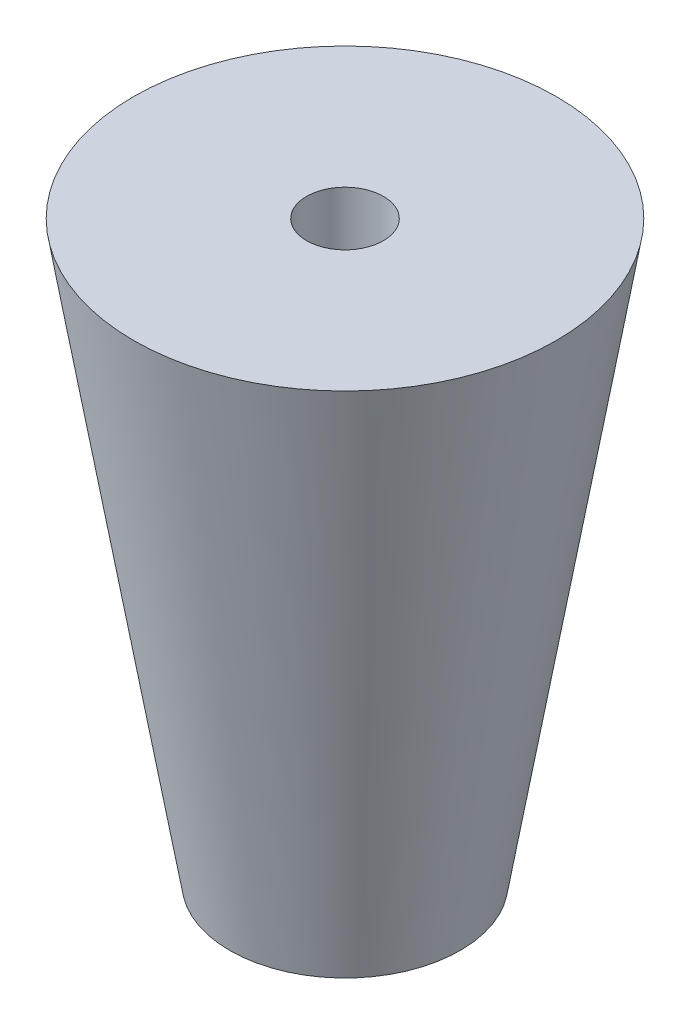
ISO-10303-21;
HEADER;
FILE_DESCRIPTION(('STEP AP214'),'2;1');
FILE_NAME('part.step','',(''),(''),'','','');
FILE_SCHEMA(('AUTOMOTIVE_DESIGN { 1 0 10303 214 1 1 1 1 }'));
ENDSEC;
DATA;
#1=APPLICATION_CONTEXT('core data for automotive mechanical design processes');
#2=APPLICATION_PROTOCOL_DEFINITION('international standard','automotive_design',2000,#1);
#3=PRODUCT_CONTEXT('',#1,'mechanical');
#4=PRODUCT('Part','Part','',(#3));
#5=PRODUCT_RELATED_PRODUCT_CATEGORY('part','',(#4));
#6=PRODUCT_DEFINITION_FORMATION('','',#4);
#7=PRODUCT_DEFINITION_CONTEXT('part definition',#1,'design');
#8=PRODUCT_DEFINITION('design','',#6,#7);
#9=PRODUCT_DEFINITION_SHAPE('','',#8);
#10=(LENGTH_UNIT() NAMED_UNIT(*) SI_UNIT(.MILLI.,.METRE.));
#11=(NAMED_UNIT(*) PLANE_ANGLE_UNIT() SI_UNIT($,.RADIAN.));
#12=(NAMED_UNIT(*) SI_UNIT($,.STERADIAN.) SOLID_ANGLE_UNIT());
#13=UNCERTAINTY_MEASURE_WITH_UNIT(LENGTH_MEASURE(1.E-05),#10,'distance_accuracy_value','');
#14=(GEOMETRIC_REPRESENTATION_CONTEXT(3) GLOBAL_UNCERTAINTY_ASSIGNED_CONTEXT((#13)) GLOBAL_UNIT_ASSIGNED_CONTEXT((#10,
#11,#12)) REPRESENTATION_CONTEXT('',''));
#15=CARTESIAN_POINT('',(0.,0.,0.));
#16=DIRECTION('',(0.,0.,1.));
#17=DIRECTION('',(1.,0.,0.));
#18=AXIS2_PLACEMENT_3D('',#15,#16,#17);
#19=CARTESIAN_POINT('',(0.,0.,-3.));
#20=DIRECTION('',(0.,1.,0.));
#21=DIRECTION('',(0.,0.,1.));
#22=AXIS2_PLACEMENT_3D('',#19,#20,#21);
#23=PLANE('',#22);
#24=CARTESIAN_POINT('',(0.,0.,0.));
#25=DIRECTION('',(0.,1.,0.));
#26=DIRECTION('',(0.,0.,1.));
#27=AXIS2_PLACEMENT_3D('',#24,#25,#26);
#28=CIRCLE('',#27,3.);
#29=CARTESIAN_POINT('',(0.,0.,3.));
#30=VERTEX_POINT('',#29);
#31=EDGE_CURVE('E10',#30,#30,#28,.T.);
#32=ORIENTED_EDGE('',*,*,#31,.F.);
#33=EDGE_LOOP('',(#32));
#34=FACE_BOUND('',#33,.T.);
#35=CARTESIAN_POINT('',(0.,0.,0.));
#36=DIRECTION('',(0.,1.,0.));
#37=DIRECTION('',(0.,0.,1.));
#38=AXIS2_PLACEMENT_3D('',#35,#36,#37);
#39=CIRCLE('',#38,1.);
#40=CARTESIAN_POINT('',(0.,0.,1.));
#41=VERTEX_POINT('',#40);
#42=EDGE_CURVE('E58',#41,#41,#39,.T.);
#43=ORIENTED_EDGE('',*,*,#42,.T.);
#44=EDGE_LOOP('',(#43));
#45=FACE_BOUND('',#44,.T.);
#46=ADVANCED_FACE('F41',(#34,#45),#23,.F.);
#47=CARTESIAN_POINT('',(0.,0.,0.));
#48=DIRECTION('',(0.,1.,0.));
#49=DIRECTION('',(0.,0.,1.));
#50=AXIS2_PLACEMENT_3D('',#47,#48,#49);
#51=CONICAL_SURFACE('',#50,3.,0.165148677414627);
#52=CARTESIAN_POINT('',(0.,15.,0.));
#53=DIRECTION('',(0.,1.,0.));
#54=DIRECTION('',(0.,0.,1.));
#55=AXIS2_PLACEMENT_3D('',#52,#53,#54);
#56=CIRCLE('',#55,5.5);
#57=CARTESIAN_POINT('',(0.,15.,5.5));
#58=VERTEX_POINT('',#57);
#59=EDGE_CURVE('E48',#58,#58,#56,.T.);
#60=ORIENTED_EDGE('',*,*,#59,.F.);
#61=EDGE_LOOP('',(#60));
#62=FACE_BOUND('',#61,.T.);
#63=ORIENTED_EDGE('',*,*,#31,.T.);
#64=EDGE_LOOP('',(#63));
#65=FACE_BOUND('',#64,.T.);
#66=ADVANCED_FACE('F74',(#62,#65),#51,.T.);
#67=CARTESIAN_POINT('',(0.,15.,-1.));
#68=DIRECTION('',(0.,-1.,0.));
#69=DIRECTION('',(0.,0.,-1.));
#70=AXIS2_PLACEMENT_3D('',#67,#68,#69);
#71=PLANE('',#70);
#72=CARTESIAN_POINT('',(0.,15.,0.));
#73=DIRECTION('',(0.,1.,0.));
#74=DIRECTION('',(0.,0.,1.));
#75=AXIS2_PLACEMENT_3D('',#72,#73,#74);
#76=CIRCLE('',#75,1.);
#77=CARTESIAN_POINT('',(0.,15.,1.));
#78=VERTEX_POINT('',#77);
#79=EDGE_CURVE('E53',#78,#78,#76,.T.);
#80=ORIENTED_EDGE('',*,*,#79,.F.);
#81=EDGE_LOOP('',(#80));
#82=FACE_BOUND('',#81,.T.);
#83=ORIENTED_EDGE('',*,*,#59,.T.);
#84=EDGE_LOOP('',(#83));
#85=FACE_BOUND('',#84,.T.);
#86=ADVANCED_FACE('F69',(#82,#85),#71,.F.);
#87=CARTESIAN_POINT('',(0.,0.,0.));
#88=DIRECTION('',(0.,1.,0.));
#89=DIRECTION('',(0.,0.,1.));
#90=AXIS2_PLACEMENT_3D('',#87,#88,#89);
#91=CYLINDRICAL_SURFACE('',#90,1.);
#92=ORIENTED_EDGE('',*,*,#42,.F.);
#93=EDGE_LOOP('',(#92));
#94=FACE_BOUND('',#93,.T.);
#95=ORIENTED_EDGE('',*,*,#79,.T.);
#96=EDGE_LOOP('',(#95));
#97=FACE_BOUND('',#96,.T.);
#98=ADVANCED_FACE('F66',(#94,#97),#91,.F.);
#99=CLOSED_SHELL('',(#46,#66,#86,#98));
#100=MANIFOLD_SOLID_BREP('B2',#99);
#101=ADVANCED_BREP_SHAPE_REPRESENTATION('',(#18,#100),#14);
#102=SHAPE_DEFINITION_REPRESENTATION(#9,#101);
ENDSEC;
END-ISO-10303-21;
